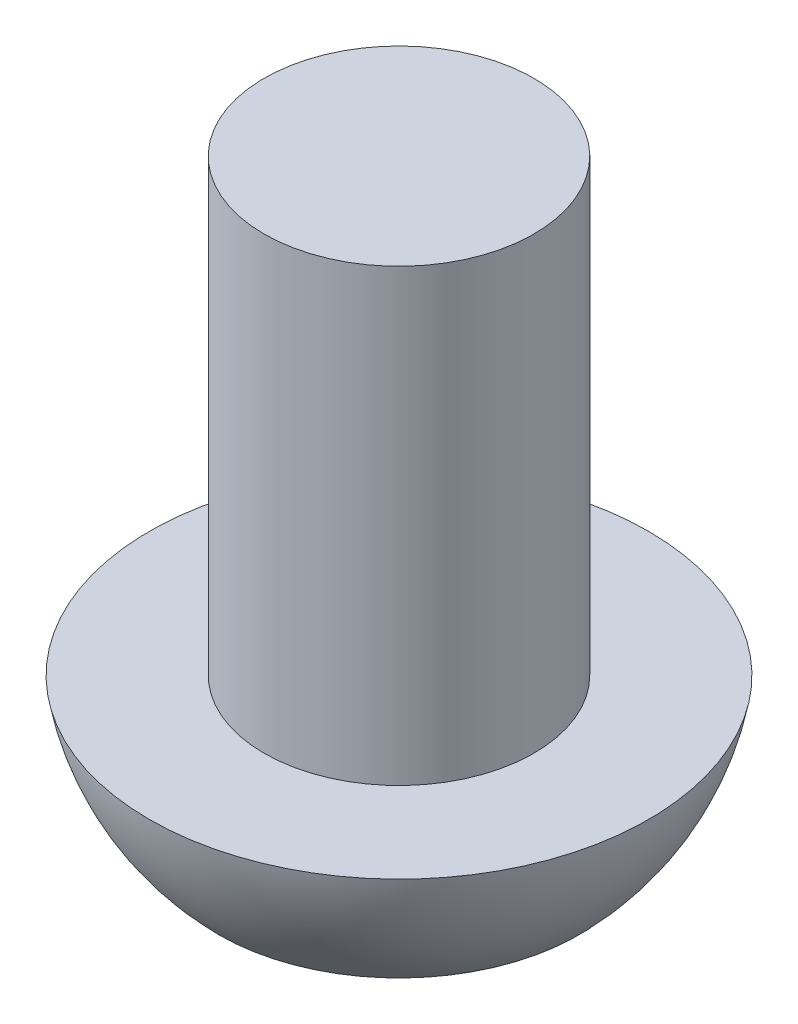
ISO-10303-21;
HEADER;
FILE_DESCRIPTION(('STEP AP214'),'2;1');
FILE_NAME('part.step','',(''),(''),'','','');
FILE_SCHEMA(('AUTOMOTIVE_DESIGN { 1 0 10303 214 1 1 1 1 }'));
ENDSEC;
DATA;
#1=APPLICATION_CONTEXT('core data for automotive mechanical design processes');
#2=APPLICATION_PROTOCOL_DEFINITION('international standard','automotive_design',2000,#1);
#3=PRODUCT_CONTEXT('',#1,'mechanical');
#4=PRODUCT('Part','Part','',(#3));
#5=PRODUCT_RELATED_PRODUCT_CATEGORY('part','',(#4));
#6=PRODUCT_DEFINITION_FORMATION('','',#4);
#7=PRODUCT_DEFINITION_CONTEXT('part definition',#1,'design');
#8=PRODUCT_DEFINITION('design','',#6,#7);
#9=PRODUCT_DEFINITION_SHAPE('','',#8);
#10=(LENGTH_UNIT() NAMED_UNIT(*) SI_UNIT(.MILLI.,.METRE.));
#11=(NAMED_UNIT(*) PLANE_ANGLE_UNIT() SI_UNIT($,.RADIAN.));
#12=(NAMED_UNIT(*) SI_UNIT($,.STERADIAN.) SOLID_ANGLE_UNIT());
#13=UNCERTAINTY_MEASURE_WITH_UNIT(LENGTH_MEASURE(1.E-05),#10,'distance_accuracy_value','');
#14=(GEOMETRIC_REPRESENTATION_CONTEXT(3) GLOBAL_UNCERTAINTY_ASSIGNED_CONTEXT((#13)) GLOBAL_UNIT_ASSIGNED_CONTEXT((#10,
#11,#12)) REPRESENTATION_CONTEXT('',''));
#15=CARTESIAN_POINT('',(0.,0.,0.));
#16=DIRECTION('',(0.,0.,1.));
#17=DIRECTION('',(1.,0.,0.));
#18=AXIS2_PLACEMENT_3D('',#15,#16,#17);
#19=CARTESIAN_POINT('',(0.,2.,0.));
#20=DIRECTION('',(0.,-1.,0.));
#21=DIRECTION('',(0.,0.,-1.));
#22=AXIS2_PLACEMENT_3D('',#19,#20,#21);
#23=CYLINDRICAL_SURFACE('',#22,1.5);
#24=CARTESIAN_POINT('',(0.,0.,0.));
#25=DIRECTION('',(0.,1.,0.));
#26=DIRECTION('',(0.,0.,1.));
#27=AXIS2_PLACEMENT_3D('',#24,#25,#26);
#28=CIRCLE('',#27,1.5);
#29=CARTESIAN_POINT('',(0.,0.,1.5));
#30=VERTEX_POINT('',#29);
#31=EDGE_CURVE('E11',#30,#30,#28,.T.);
#32=ORIENTED_EDGE('',*,*,#31,.T.);
#33=EDGE_LOOP('',(#32));
#34=FACE_BOUND('',#33,.T.);
#35=CARTESIAN_POINT('',(0.,5.,0.));
#36=DIRECTION('',(0.,1.,0.));
#37=DIRECTION('',(0.,0.,1.));
#38=AXIS2_PLACEMENT_3D('',#35,#36,#37);
#39=CIRCLE('',#38,1.5);
#40=CARTESIAN_POINT('',(0.,5.,1.5));
#41=VERTEX_POINT('',#40);
#42=EDGE_CURVE('E122',#41,#41,#39,.T.);
#43=ORIENTED_EDGE('',*,*,#42,.F.);
#44=EDGE_LOOP('',(#43));
#45=FACE_BOUND('',#44,.T.);
#46=ADVANCED_FACE('F33',(#34,#45),#23,.T.);
#47=CARTESIAN_POINT('',(0.,0.,0.));
#48=DIRECTION('',(0.,1.,0.));
#49=DIRECTION('',(0.,0.,1.));
#50=AXIS2_PLACEMENT_3D('',#47,#48,#49);
#51=PLANE('',#50);
#52=CARTESIAN_POINT('',(0.,0.,0.));
#53=DIRECTION('',(0.,1.,0.));
#54=DIRECTION('',(0.,0.,1.));
#55=AXIS2_PLACEMENT_3D('',#52,#53,#54);
#56=CIRCLE('',#55,2.775);
#57=CARTESIAN_POINT('',(0.,0.,2.775));
#58=VERTEX_POINT('',#57);
#59=EDGE_CURVE('E40',#58,#58,#56,.T.);
#60=ORIENTED_EDGE('',*,*,#59,.T.);
#61=EDGE_LOOP('',(#60));
#62=FACE_BOUND('',#61,.T.);
#63=ORIENTED_EDGE('',*,*,#31,.F.);
#64=EDGE_LOOP('',(#63));
#65=FACE_BOUND('',#64,.T.);
#66=ADVANCED_FACE('F145',(#62,#65),#51,.T.);
#67=CARTESIAN_POINT('',(0.,0.483541666666668,0.));
#68=DIRECTION('',(0.,1.,0.));
#69=DIRECTION('',(0.,0.,1.));
#70=AXIS2_PLACEMENT_3D('',#67,#68,#69);
#71=SPHERICAL_SURFACE('',#70,2.81681336680348);
#72=CARTESIAN_POINT('',(0.,-1.5,0.));
#73=DIRECTION('',(0.,1.,0.));
#74=DIRECTION('',(0.,0.,1.));
#75=AXIS2_PLACEMENT_3D('',#72,#73,#74);
#76=CIRCLE('',#75,2.);
#77=CARTESIAN_POINT('',(0.,-1.5,2.));
#78=VERTEX_POINT('',#77);
#79=EDGE_CURVE('E135',#78,#78,#76,.T.);
#80=CARTESIAN_POINT('',(0.,0.,2.775));
#81=CARTESIAN_POINT('',(0.,-0.017596668625069,2.77193381611133));
#82=CARTESIAN_POINT('',(0.,-0.0351641642304122,2.76870021525294));
#83=CARTESIAN_POINT('',(0.,-0.0702344705442025,2.76189944497329));
#84=CARTESIAN_POINT('',(0.,-0.0877372812526497,2.75833227555203));
#85=CARTESIAN_POINT('',(0.,-0.122671878915203,2.75086563352325));
#86=CARTESIAN_POINT('',(0.,-0.140103665869309,2.74696616091572));
#87=CARTESIAN_POINT('',(0.,-0.174889909139979,2.73883633048932));
#88=CARTESIAN_POINT('',(0.,-0.192244365456543,2.73460597267045));
#89=CARTESIAN_POINT('',(0.,-0.226869666872682,2.72581590087021));
#90=CARTESIAN_POINT('',(0.,-0.244140511972257,2.72125618688885));
#91=CARTESIAN_POINT('',(0.,-0.278592341082491,2.71180905332199));
#92=CARTESIAN_POINT('',(0.,-0.295773325093149,2.7069216337365));
#93=CARTESIAN_POINT('',(0.,-0.330039214551855,2.6968208574875));
#94=CARTESIAN_POINT('',(0.,-0.347124119999904,2.69160750082399));
#95=CARTESIAN_POINT('',(0.,-0.381191669660903,2.6808567370618));
#96=CARTESIAN_POINT('',(0.,-0.398174313873855,2.67531932996312));
#97=CARTESIAN_POINT('',(0.,-0.43203119538977,2.66392246919597));
#98=CARTESIAN_POINT('',(0.,-0.448905432692733,2.65806301552752));
#99=CARTESIAN_POINT('',(0.,-0.482539393946354,2.6460241820403));
#100=CARTESIAN_POINT('',(0.,-0.499299117897012,2.63984480222155));
#101=CARTESIAN_POINT('',(0.,-0.532697987443132,2.62716835262477));
#102=CARTESIAN_POINT('',(0.,-0.549337133038594,2.62067128284674));
#103=CARTESIAN_POINT('',(0.,-0.582488824506452,2.60736180448883));
#104=CARTESIAN_POINT('',(0.,-0.599001370378848,2.60054939590894));
#105=CARTESIAN_POINT('',(0.,-0.631893886846516,2.58661170521918));
#106=CARTESIAN_POINT('',(0.,-0.64827385744179,2.5794864231093));
#107=CARTESIAN_POINT('',(0.,-0.680895295777463,2.56492556385405));
#108=CARTESIAN_POINT('',(0.,-0.697136763517864,2.55748998670867));
#109=CARTESIAN_POINT('',(0.,-0.729475318687401,2.54231122816634));
#110=CARTESIAN_POINT('',(0.,-0.745572406116537,2.53456804676939));
#111=CARTESIAN_POINT('',(0.,-0.777616375455449,2.51877688182356));
#112=CARTESIAN_POINT('',(0.,-0.793563257365225,2.51072889827468));
#113=CARTESIAN_POINT('',(0.,-0.825301044813638,2.49433104142634));
#114=CARTESIAN_POINT('',(0.,-0.841091950352275,2.48598116812687));
#115=CARTESIAN_POINT('',(0.,-0.872512070651303,2.46898255342643));
#116=CARTESIAN_POINT('',(0.,-0.888141285411695,2.46033381202545));
#117=CARTESIAN_POINT('',(0.,-0.919232368259726,2.44274059092537));
#118=CARTESIAN_POINT('',(0.,-0.934694236347365,2.43379611122626));
#119=CARTESIAN_POINT('',(0.,-0.965445030514739,2.41561465035494));
#120=CARTESIAN_POINT('',(0.,-0.980733956594473,2.40637766918273));
#121=CARTESIAN_POINT('',(0.,-1.01113333399507,2.38761454804056));
#122=CARTESIAN_POINT('',(0.,-1.02624378531592,2.3780884080706));
#123=CARTESIAN_POINT('',(0.,-1.05628074503421,2.35875041664901));
#124=CARTESIAN_POINT('',(0.,-1.07120725343164,2.34893856519737));
#125=CARTESIAN_POINT('',(0.,-1.10087092570356,2.3290327015215));
#126=CARTESIAN_POINT('',(0.,-1.11560808957805,2.31893868929726));
#127=CARTESIAN_POINT('',(0.,-1.14488773972511,2.29847215689412));
#128=CARTESIAN_POINT('',(0.,-1.15943022599768,2.28809963671522));
#129=CARTESIAN_POINT('',(0.,-1.18831525830951,2.26707984200469));
#130=CARTESIAN_POINT('',(0.,-1.20265780434878,2.25643256747307));
#131=CARTESIAN_POINT('',(0.,-1.23113776592535,2.23486711709585));
#132=CARTESIAN_POINT('',(0.,-1.24527518146265,2.22394894125025));
#133=CARTESIAN_POINT('',(0.,-1.27333976596776,2.20184563928461));
#134=CARTESIAN_POINT('',(0.,-1.28726693493556,2.19066051316457));
#135=CARTESIAN_POINT('',(0.,-1.31490598643537,2.16802735841624));
#136=CARTESIAN_POINT('',(0.,-1.32861786896737,2.15657932978795));
#137=CARTESIAN_POINT('',(0.,-1.35582138519935,2.13342451247));
#138=CARTESIAN_POINT('',(0.,-1.36931301889934,2.12171772378032));
#139=CARTESIAN_POINT('',(0.,-1.39607115640811,2.09804962413734));
#140=CARTESIAN_POINT('',(0.,-1.4093376602169,2.08608831318404));
#141=CARTESIAN_POINT('',(0.,-1.4356407322578,2.06191549253271));
#142=CARTESIAN_POINT('',(0.,-1.44867730048991,2.04970398283467));
#143=CARTESIAN_POINT('',(0.,-1.47451580165246,2.02503520258488));
#144=CARTESIAN_POINT('',(0.,-1.4873177345829,2.01257793203312));
#145=CARTESIAN_POINT('',(0.,-1.5,2.));
#146=B_SPLINE_CURVE_WITH_KNOTS('',3,(#80,#81,#82,#83,#84,#85,#86,#87,#88,#89,#90,#91,#92,#93,
#94,#95,#96,#97,#98,#99,#100,#101,#102,#103,#104,#105,#106,#107,#108,#109,#110,#111,#112,#113,
#114,#115,#116,#117,#118,#119,#120,#121,#122,#123,#124,#125,#126,#127,#128,#129,#130,#131,#132,
#133,#134,#135,#136,#137,#138,#139,#140,#141,#142,#143,#144,#145),.UNSPECIFIED.,.F.,.F.,(4,2,2,
2,2,2,2,2,2,2,2,2,2,2,2,2,2,2,2,2,2,2,2,2,2,2,2,2,2,2,2,2,4),(0.,0.053584618585212,
0.107169237170424,0.160753855755636,0.214338474340848,0.26792309292606,0.321507711511272,
0.375092330096484,0.428676948681696,0.482261567266908,0.53584618585212,0.589430804437332,
0.643015423022544,0.696600041607757,0.750184660192968,0.803769278778181,0.857353897363393,
0.910938515948605,0.964523134533817,1.01810775311903,1.07169237170424,1.12527699028945,
1.17886160887467,1.23244622745988,1.28603084604509,1.3396154646303,1.39320008321551,
1.44678470180073,1.50036932038594,1.55395393897115,1.60753855755636,1.66112317614157,
1.71470779472679),.UNSPECIFIED.);
#147=EDGE_CURVE('BSEAM148',#58,#78,#146,.T.);
#148=ORIENTED_EDGE('',*,*,#59,.F.);
#149=ORIENTED_EDGE('',*,*,#79,.T.);
#150=ORIENTED_EDGE('',*,*,#147,.T.);
#151=ORIENTED_EDGE('',*,*,#147,.F.);
#152=EDGE_LOOP('',(#148,#150,#149,#151));
#153=FACE_BOUND('',#152,.T.);
#154=ADVANCED_FACE('F148',(#153),#71,.T.);
#155=CARTESIAN_POINT('',(0.,-1.5,0.));
#156=DIRECTION('',(0.,1.,0.));
#157=DIRECTION('',(0.,0.,1.));
#158=AXIS2_PLACEMENT_3D('',#155,#156,#157);
#159=PLANE('',#158);
#160=DIRECTION('',(0.5,0.,-0.866025403784439));
#161=VECTOR('',#160,1.);
#162=CARTESIAN_POINT('',(-1.17779454914684,-1.5,0.));
#163=LINE('',#162,#161);
#164=CARTESIAN_POINT('',(-1.17779454914684,-1.5,0.));
#165=VERTEX_POINT('',#164);
#166=CARTESIAN_POINT('',(-0.588897274573419,-1.5,-1.02));
#167=VERTEX_POINT('',#166);
#168=EDGE_CURVE('E121',#165,#167,#163,.T.);
#169=ORIENTED_EDGE('',*,*,#168,.F.);
#170=DIRECTION('',(-0.5,0.,-0.866025403784439));
#171=VECTOR('',#170,1.);
#172=CARTESIAN_POINT('',(-0.588897274573418,-1.5,1.02));
#173=LINE('',#172,#171);
#174=CARTESIAN_POINT('',(-0.588897274573418,-1.5,1.02));
#175=VERTEX_POINT('',#174);
#176=EDGE_CURVE('E47',#175,#165,#173,.T.);
#177=ORIENTED_EDGE('',*,*,#176,.F.);
#178=DIRECTION('',(-1.,0.,0.));
#179=VECTOR('',#178,1.);
#180=CARTESIAN_POINT('',(0.588897274573419,-1.5,1.02));
#181=LINE('',#180,#179);
#182=CARTESIAN_POINT('',(0.588897274573419,-1.5,1.02));
#183=VERTEX_POINT('',#182);
#184=EDGE_CURVE('E131',#183,#175,#181,.T.);
#185=ORIENTED_EDGE('',*,*,#184,.F.);
#186=DIRECTION('',(-0.5,0.,0.866025403784439));
#187=VECTOR('',#186,1.);
#188=CARTESIAN_POINT('',(1.17779454914684,-1.5,0.));
#189=LINE('',#188,#187);
#190=CARTESIAN_POINT('',(1.17779454914684,-1.5,0.));
#191=VERTEX_POINT('',#190);
#192=EDGE_CURVE('E129',#191,#183,#189,.T.);
#193=ORIENTED_EDGE('',*,*,#192,.F.);
#194=DIRECTION('',(0.5,0.,0.866025403784439));
#195=VECTOR('',#194,1.);
#196=CARTESIAN_POINT('',(0.588897274573418,-1.5,-1.02));
#197=LINE('',#196,#195);
#198=CARTESIAN_POINT('',(0.588897274573418,-1.5,-1.02));
#199=VERTEX_POINT('',#198);
#200=EDGE_CURVE('E95',#199,#191,#197,.T.);
#201=ORIENTED_EDGE('',*,*,#200,.F.);
#202=DIRECTION('',(1.,0.,0.));
#203=VECTOR('',#202,1.);
#204=CARTESIAN_POINT('',(-0.588897274573419,-1.5,-1.02));
#205=LINE('',#204,#203);
#206=EDGE_CURVE('E125',#167,#199,#205,.T.);
#207=ORIENTED_EDGE('',*,*,#206,.F.);
#208=EDGE_LOOP('',(#169,#177,#185,#193,#201,#207));
#209=FACE_BOUND('',#208,.T.);
#210=ORIENTED_EDGE('',*,*,#79,.F.);
#211=EDGE_LOOP('',(#210));
#212=FACE_BOUND('',#211,.T.);
#213=ADVANCED_FACE('F151',(#209,#212),#159,.F.);
#214=CARTESIAN_POINT('',(-0.588897274573418,-0.5,1.02));
#215=DIRECTION('',(-0.866025403784438,0.,0.5));
#216=DIRECTION('',(0.5,0.,0.866025403784439));
#217=AXIS2_PLACEMENT_3D('',#214,#215,#216);
#218=PLANE('',#217);
#219=ORIENTED_EDGE('',*,*,#176,.T.);
#220=DIRECTION('',(0.,-1.,0.));
#221=VECTOR('',#220,1.);
#222=CARTESIAN_POINT('',(-1.17779454914684,-0.5,0.));
#223=LINE('',#222,#221);
#224=CARTESIAN_POINT('',(-1.17779454914684,-0.5,0.));
#225=VERTEX_POINT('',#224);
#226=EDGE_CURVE('E77',#225,#165,#223,.T.);
#227=ORIENTED_EDGE('',*,*,#226,.F.);
#228=DIRECTION('',(-0.5,0.,-0.866025403784439));
#229=VECTOR('',#228,1.);
#230=CARTESIAN_POINT('',(-0.588897274573418,-0.5,1.02));
#231=LINE('',#230,#229);
#232=CARTESIAN_POINT('',(-0.588897274573418,-0.5,1.02));
#233=VERTEX_POINT('',#232);
#234=EDGE_CURVE('E133',#233,#225,#231,.T.);
#235=ORIENTED_EDGE('',*,*,#234,.F.);
#236=DIRECTION('',(0.,-1.,0.));
#237=VECTOR('',#236,1.);
#238=CARTESIAN_POINT('',(-0.588897274573418,-0.5,1.02));
#239=LINE('',#238,#237);
#240=EDGE_CURVE('E55',#233,#175,#239,.T.);
#241=ORIENTED_EDGE('',*,*,#240,.T.);
#242=EDGE_LOOP('',(#219,#227,#235,#241));
#243=FACE_BOUND('',#242,.T.);
#244=ADVANCED_FACE('F156',(#243),#218,.F.);
#245=CARTESIAN_POINT('',(0.588897274573419,-0.5,1.02));
#246=DIRECTION('',(0.,0.,1.));
#247=DIRECTION('',(1.,0.,0.));
#248=AXIS2_PLACEMENT_3D('',#245,#246,#247);
#249=PLANE('',#248);
#250=ORIENTED_EDGE('',*,*,#184,.T.);
#251=ORIENTED_EDGE('',*,*,#240,.F.);
#252=DIRECTION('',(-1.,0.,0.));
#253=VECTOR('',#252,1.);
#254=CARTESIAN_POINT('',(0.588897274573419,-0.5,1.02));
#255=LINE('',#254,#253);
#256=CARTESIAN_POINT('',(0.588897274573419,-0.5,1.02));
#257=VERTEX_POINT('',#256);
#258=EDGE_CURVE('E107',#257,#233,#255,.T.);
#259=ORIENTED_EDGE('',*,*,#258,.F.);
#260=DIRECTION('',(0.,-1.,0.));
#261=VECTOR('',#260,1.);
#262=CARTESIAN_POINT('',(0.588897274573419,-0.5,1.02));
#263=LINE('',#262,#261);
#264=EDGE_CURVE('E99',#257,#183,#263,.T.);
#265=ORIENTED_EDGE('',*,*,#264,.T.);
#266=EDGE_LOOP('',(#250,#251,#259,#265));
#267=FACE_BOUND('',#266,.T.);
#268=ADVANCED_FACE('F162',(#267),#249,.F.);
#269=CARTESIAN_POINT('',(1.17779454914684,-0.5,0.));
#270=DIRECTION('',(0.866025403784439,0.,0.5));
#271=DIRECTION('',(0.5,0.,-0.866025403784439));
#272=AXIS2_PLACEMENT_3D('',#269,#270,#271);
#273=PLANE('',#272);
#274=ORIENTED_EDGE('',*,*,#192,.T.);
#275=ORIENTED_EDGE('',*,*,#264,.F.);
#276=DIRECTION('',(-0.5,0.,0.866025403784439));
#277=VECTOR('',#276,1.);
#278=CARTESIAN_POINT('',(1.17779454914684,-0.5,0.));
#279=LINE('',#278,#277);
#280=CARTESIAN_POINT('',(1.17779454914684,-0.5,0.));
#281=VERTEX_POINT('',#280);
#282=EDGE_CURVE('E103',#281,#257,#279,.T.);
#283=ORIENTED_EDGE('',*,*,#282,.F.);
#284=DIRECTION('',(0.,-1.,0.));
#285=VECTOR('',#284,1.);
#286=CARTESIAN_POINT('',(1.17779454914684,-0.5,0.));
#287=LINE('',#286,#285);
#288=EDGE_CURVE('E88',#281,#191,#287,.T.);
#289=ORIENTED_EDGE('',*,*,#288,.T.);
#290=EDGE_LOOP('',(#274,#275,#283,#289));
#291=FACE_BOUND('',#290,.T.);
#292=ADVANCED_FACE('F104',(#291),#273,.F.);
#293=CARTESIAN_POINT('',(0.588897274573418,-0.5,-1.02));
#294=DIRECTION('',(0.866025403784439,0.,-0.5));
#295=DIRECTION('',(-0.5,0.,-0.866025403784439));
#296=AXIS2_PLACEMENT_3D('',#293,#294,#295);
#297=PLANE('',#296);
#298=ORIENTED_EDGE('',*,*,#200,.T.);
#299=ORIENTED_EDGE('',*,*,#288,.F.);
#300=DIRECTION('',(0.5,0.,0.866025403784439));
#301=VECTOR('',#300,1.);
#302=CARTESIAN_POINT('',(0.588897274573418,-0.5,-1.02));
#303=LINE('',#302,#301);
#304=CARTESIAN_POINT('',(0.588897274573418,-0.5,-1.02));
#305=VERTEX_POINT('',#304);
#306=EDGE_CURVE('E92',#305,#281,#303,.T.);
#307=ORIENTED_EDGE('',*,*,#306,.F.);
#308=DIRECTION('',(0.,-1.,0.));
#309=VECTOR('',#308,1.);
#310=CARTESIAN_POINT('',(0.588897274573418,-0.5,-1.02));
#311=LINE('',#310,#309);
#312=EDGE_CURVE('E100',#305,#199,#311,.T.);
#313=ORIENTED_EDGE('',*,*,#312,.T.);
#314=EDGE_LOOP('',(#298,#299,#307,#313));
#315=FACE_BOUND('',#314,.T.);
#316=ADVANCED_FACE('F90',(#315),#297,.F.);
#317=CARTESIAN_POINT('',(-0.588897274573419,-0.5,-1.02));
#318=DIRECTION('',(0.,0.,-1.));
#319=DIRECTION('',(-1.,0.,0.));
#320=AXIS2_PLACEMENT_3D('',#317,#318,#319);
#321=PLANE('',#320);
#322=ORIENTED_EDGE('',*,*,#206,.T.);
#323=ORIENTED_EDGE('',*,*,#312,.F.);
#324=DIRECTION('',(1.,0.,0.));
#325=VECTOR('',#324,1.);
#326=CARTESIAN_POINT('',(-0.588897274573419,-0.5,-1.02));
#327=LINE('',#326,#325);
#328=CARTESIAN_POINT('',(-0.588897274573419,-0.5,-1.02));
#329=VERTEX_POINT('',#328);
#330=EDGE_CURVE('E113',#329,#305,#327,.T.);
#331=ORIENTED_EDGE('',*,*,#330,.F.);
#332=DIRECTION('',(0.,-1.,0.));
#333=VECTOR('',#332,1.);
#334=CARTESIAN_POINT('',(-0.588897274573419,-0.5,-1.02));
#335=LINE('',#334,#333);
#336=EDGE_CURVE('E138',#329,#167,#335,.T.);
#337=ORIENTED_EDGE('',*,*,#336,.T.);
#338=EDGE_LOOP('',(#322,#323,#331,#337));
#339=FACE_BOUND('',#338,.T.);
#340=ADVANCED_FACE('F181',(#339),#321,.F.);
#341=CARTESIAN_POINT('',(-1.17779454914684,-0.5,0.));
#342=DIRECTION('',(-0.866025403784439,0.,-0.5));
#343=DIRECTION('',(-0.5,0.,0.866025403784439));
#344=AXIS2_PLACEMENT_3D('',#341,#342,#343);
#345=PLANE('',#344);
#346=ORIENTED_EDGE('',*,*,#168,.T.);
#347=ORIENTED_EDGE('',*,*,#336,.F.);
#348=DIRECTION('',(0.5,0.,-0.866025403784439));
#349=VECTOR('',#348,1.);
#350=CARTESIAN_POINT('',(-1.17779454914684,-0.5,0.));
#351=LINE('',#350,#349);
#352=EDGE_CURVE('E115',#225,#329,#351,.T.);
#353=ORIENTED_EDGE('',*,*,#352,.F.);
#354=ORIENTED_EDGE('',*,*,#226,.T.);
#355=EDGE_LOOP('',(#346,#347,#353,#354));
#356=FACE_BOUND('',#355,.T.);
#357=ADVANCED_FACE('F178',(#356),#345,.F.);
#358=CARTESIAN_POINT('',(0.,-0.5,0.));
#359=DIRECTION('',(0.,-1.,0.));
#360=DIRECTION('',(0.,0.,-1.));
#361=AXIS2_PLACEMENT_3D('',#358,#359,#360);
#362=PLANE('',#361);
#363=ORIENTED_EDGE('',*,*,#234,.T.);
#364=ORIENTED_EDGE('',*,*,#352,.T.);
#365=ORIENTED_EDGE('',*,*,#330,.T.);
#366=ORIENTED_EDGE('',*,*,#306,.T.);
#367=ORIENTED_EDGE('',*,*,#282,.T.);
#368=ORIENTED_EDGE('',*,*,#258,.T.);
#369=EDGE_LOOP('',(#363,#364,#365,#366,#367,#368));
#370=FACE_BOUND('',#369,.T.);
#371=ADVANCED_FACE('F110',(#370),#362,.T.);
#372=CARTESIAN_POINT('',(0.,5.,0.));
#373=DIRECTION('',(0.,1.,0.));
#374=DIRECTION('',(0.,0.,1.));
#375=AXIS2_PLACEMENT_3D('',#372,#373,#374);
#376=PLANE('',#375);
#377=ORIENTED_EDGE('',*,*,#42,.T.);
#378=EDGE_LOOP('',(#377));
#379=FACE_BOUND('',#378,.T.);
#380=ADVANCED_FACE('F200',(#379),#376,.T.);
#381=CLOSED_SHELL('',(#46,#66,#154,#213,#244,#268,#292,#316,#340,#357,#371,#380));
#382=MANIFOLD_SOLID_BREP('B2',#381);
#383=ADVANCED_BREP_SHAPE_REPRESENTATION('',(#18,#382),#14);
#384=SHAPE_DEFINITION_REPRESENTATION(#9,#383);
ENDSEC;
END-ISO-10303-21;
